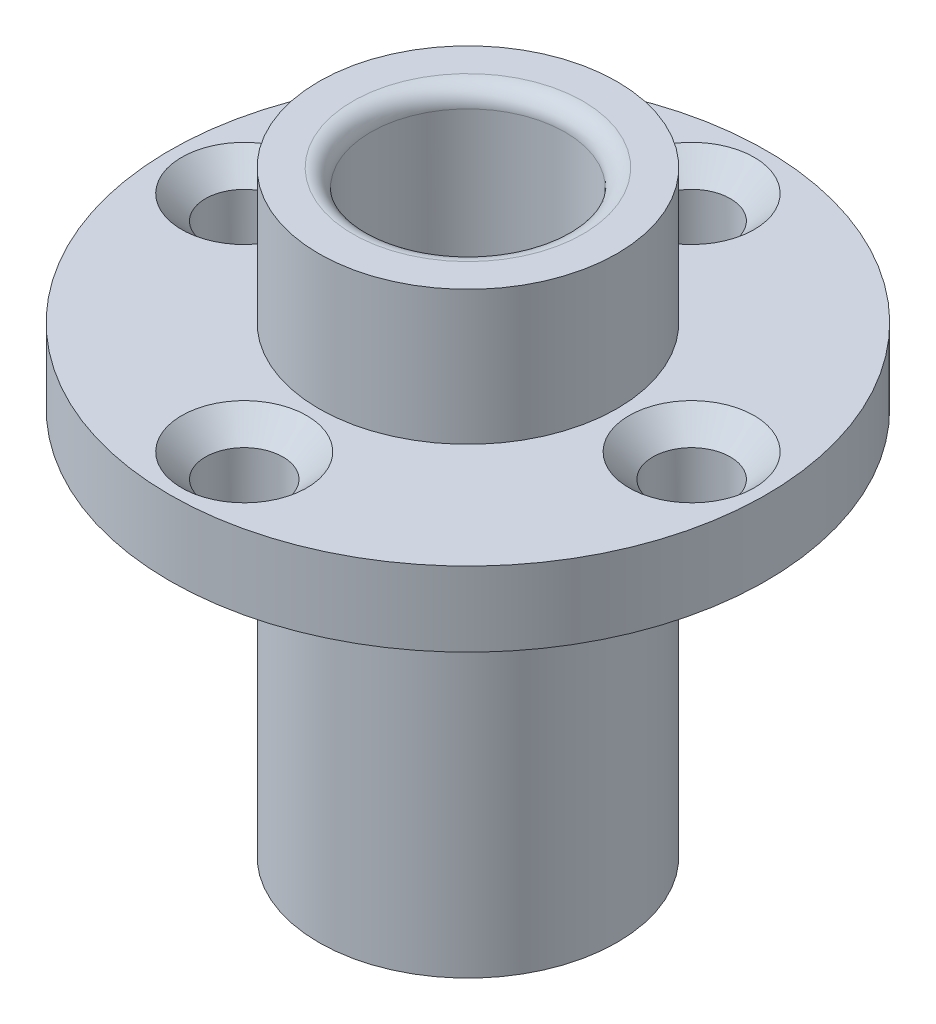
ISO-10303-21;
HEADER;
FILE_DESCRIPTION(('STEP AP214'),'2;1');
FILE_NAME('part.step','',(''),(''),'','','');
FILE_SCHEMA(('AUTOMOTIVE_DESIGN { 1 0 10303 214 1 1 1 1 }'));
ENDSEC;
DATA;
#1=APPLICATION_CONTEXT('core data for automotive mechanical design processes');
#2=APPLICATION_PROTOCOL_DEFINITION('international standard','automotive_design',2000,#1);
#3=PRODUCT_CONTEXT('',#1,'mechanical');
#4=PRODUCT('Part','Part','',(#3));
#5=PRODUCT_RELATED_PRODUCT_CATEGORY('part','',(#4));
#6=PRODUCT_DEFINITION_FORMATION('','',#4);
#7=PRODUCT_DEFINITION_CONTEXT('part definition',#1,'design');
#8=PRODUCT_DEFINITION('design','',#6,#7);
#9=PRODUCT_DEFINITION_SHAPE('','',#8);
#10=(LENGTH_UNIT() NAMED_UNIT(*) SI_UNIT(.MILLI.,.METRE.));
#11=(NAMED_UNIT(*) PLANE_ANGLE_UNIT() SI_UNIT($,.RADIAN.));
#12=(NAMED_UNIT(*) SI_UNIT($,.STERADIAN.) SOLID_ANGLE_UNIT());
#13=UNCERTAINTY_MEASURE_WITH_UNIT(LENGTH_MEASURE(1.E-05),#10,'distance_accuracy_value','');
#14=(GEOMETRIC_REPRESENTATION_CONTEXT(3) GLOBAL_UNCERTAINTY_ASSIGNED_CONTEXT((#13)) GLOBAL_UNIT_ASSIGNED_CONTEXT((#10,
#11,#12)) REPRESENTATION_CONTEXT('',''));
#15=CARTESIAN_POINT('',(0.,0.,0.));
#16=DIRECTION('',(0.,0.,1.));
#17=DIRECTION('',(1.,0.,0.));
#18=AXIS2_PLACEMENT_3D('',#15,#16,#17);
#19=CARTESIAN_POINT('',(6.35,12.7,0.));
#20=DIRECTION('',(0.,-1.,0.));
#21=DIRECTION('',(0.,0.,-1.));
#22=AXIS2_PLACEMENT_3D('',#19,#20,#21);
#23=PLANE('',#22);
#24=CARTESIAN_POINT('',(0.,12.7,0.));
#25=DIRECTION('',(0.,-1.,0.));
#26=DIRECTION('',(0.,0.,-1.));
#27=AXIS2_PLACEMENT_3D('',#24,#25,#26);
#28=CIRCLE('',#27,4.9022);
#29=CARTESIAN_POINT('',(0.,12.7,-4.9022));
#30=VERTEX_POINT('',#29);
#31=EDGE_CURVE('E10',#30,#30,#28,.T.);
#32=ORIENTED_EDGE('',*,*,#31,.T.);
#33=EDGE_LOOP('',(#32));
#34=FACE_BOUND('',#33,.T.);
#35=CARTESIAN_POINT('',(0.,12.7,0.));
#36=DIRECTION('',(0.,1.,0.));
#37=DIRECTION('',(0.,0.,1.));
#38=AXIS2_PLACEMENT_3D('',#35,#36,#37);
#39=CIRCLE('',#38,6.35);
#40=CARTESIAN_POINT('',(0.,12.7,6.35));
#41=VERTEX_POINT('',#40);
#42=EDGE_CURVE('E121',#41,#41,#39,.T.);
#43=ORIENTED_EDGE('',*,*,#42,.T.);
#44=EDGE_LOOP('',(#43));
#45=FACE_BOUND('',#44,.T.);
#46=ADVANCED_FACE('F45',(#34,#45),#23,.F.);
#47=CARTESIAN_POINT('',(0.,0.,0.));
#48=DIRECTION('',(0.,1.,0.));
#49=DIRECTION('',(0.,0.,1.));
#50=AXIS2_PLACEMENT_3D('',#47,#48,#49);
#51=CYLINDRICAL_SURFACE('',#50,4.1402);
#52=CARTESIAN_POINT('',(0.,-11.938,0.));
#53=DIRECTION('',(0.,1.,0.));
#54=DIRECTION('',(0.,0.,1.));
#55=AXIS2_PLACEMENT_3D('',#52,#53,#54);
#56=CIRCLE('',#55,4.1402);
#57=CARTESIAN_POINT('',(0.,-11.938,4.1402));
#58=VERTEX_POINT('',#57);
#59=EDGE_CURVE('E53',#58,#58,#56,.F.);
#60=ORIENTED_EDGE('',*,*,#59,.T.);
#61=EDGE_LOOP('',(#60));
#62=FACE_BOUND('',#61,.T.);
#63=CARTESIAN_POINT('',(0.,11.938,0.));
#64=DIRECTION('',(0.,-1.,0.));
#65=DIRECTION('',(0.,0.,-1.));
#66=AXIS2_PLACEMENT_3D('',#63,#64,#65);
#67=CIRCLE('',#66,4.1402);
#68=CARTESIAN_POINT('',(0.,11.938,-4.1402));
#69=VERTEX_POINT('',#68);
#70=EDGE_CURVE('E58',#69,#69,#67,.F.);
#71=ORIENTED_EDGE('',*,*,#70,.T.);
#72=EDGE_LOOP('',(#71));
#73=FACE_BOUND('',#72,.T.);
#74=ADVANCED_FACE('F164',(#62,#73),#51,.F.);
#75=CARTESIAN_POINT('',(4.1402,-12.7,0.));
#76=DIRECTION('',(0.,1.,0.));
#77=DIRECTION('',(0.,0.,1.));
#78=AXIS2_PLACEMENT_3D('',#75,#76,#77);
#79=PLANE('',#78);
#80=CARTESIAN_POINT('',(0.,-12.7,0.));
#81=DIRECTION('',(0.,1.,0.));
#82=DIRECTION('',(0.,0.,1.));
#83=AXIS2_PLACEMENT_3D('',#80,#81,#82);
#84=CIRCLE('',#83,4.9022);
#85=CARTESIAN_POINT('',(0.,-12.7,4.9022));
#86=VERTEX_POINT('',#85);
#87=EDGE_CURVE('E63',#86,#86,#84,.T.);
#88=ORIENTED_EDGE('',*,*,#87,.T.);
#89=EDGE_LOOP('',(#88));
#90=FACE_BOUND('',#89,.T.);
#91=CARTESIAN_POINT('',(0.,-12.7,0.));
#92=DIRECTION('',(0.,1.,0.));
#93=DIRECTION('',(0.,0.,1.));
#94=AXIS2_PLACEMENT_3D('',#91,#92,#93);
#95=CIRCLE('',#94,6.35);
#96=CARTESIAN_POINT('',(0.,-12.7,6.35));
#97=VERTEX_POINT('',#96);
#98=EDGE_CURVE('E101',#97,#97,#95,.T.);
#99=ORIENTED_EDGE('',*,*,#98,.F.);
#100=EDGE_LOOP('',(#99));
#101=FACE_BOUND('',#100,.T.);
#102=ADVANCED_FACE('F170',(#90,#101),#79,.F.);
#103=CARTESIAN_POINT('',(0.,0.,0.));
#104=DIRECTION('',(0.,1.,0.));
#105=DIRECTION('',(0.,0.,1.));
#106=AXIS2_PLACEMENT_3D('',#103,#104,#105);
#107=CYLINDRICAL_SURFACE('',#106,6.35);
#108=CARTESIAN_POINT('',(0.,3.81,0.));
#109=DIRECTION('',(0.,1.,0.));
#110=DIRECTION('',(0.,0.,1.));
#111=AXIS2_PLACEMENT_3D('',#108,#109,#110);
#112=CIRCLE('',#111,6.35);
#113=CARTESIAN_POINT('',(0.,3.81,6.35));
#114=VERTEX_POINT('',#113);
#115=EDGE_CURVE('E105',#114,#114,#112,.T.);
#116=ORIENTED_EDGE('',*,*,#115,.F.);
#117=EDGE_LOOP('',(#116));
#118=FACE_BOUND('',#117,.T.);
#119=ORIENTED_EDGE('',*,*,#98,.T.);
#120=EDGE_LOOP('',(#119));
#121=FACE_BOUND('',#120,.T.);
#122=ADVANCED_FACE('F209',(#118,#121),#107,.T.);
#123=CARTESIAN_POINT('',(6.35,3.81,0.));
#124=DIRECTION('',(0.,1.,0.));
#125=DIRECTION('',(0.,0.,1.));
#126=AXIS2_PLACEMENT_3D('',#123,#124,#125);
#127=PLANE('',#126);
#128=CARTESIAN_POINT('',(9.525,3.81,0.));
#129=DIRECTION('',(0.,1.,0.));
#130=DIRECTION('',(0.,0.,1.));
#131=AXIS2_PLACEMENT_3D('',#128,#129,#130);
#132=CIRCLE('',#131,1.65);
#133=CARTESIAN_POINT('',(9.525,3.81,1.65000000000003));
#134=VERTEX_POINT('',#133);
#135=EDGE_CURVE('E129',#134,#134,#132,.T.);
#136=ORIENTED_EDGE('',*,*,#135,.T.);
#137=EDGE_LOOP('',(#136));
#138=FACE_BOUND('',#137,.T.);
#139=CARTESIAN_POINT('',(0.,3.81,9.525));
#140=DIRECTION('',(0.,1.,0.));
#141=DIRECTION('',(0.,0.,1.));
#142=AXIS2_PLACEMENT_3D('',#139,#140,#141);
#143=CIRCLE('',#142,1.65);
#144=CARTESIAN_POINT('',(0.,3.81,11.175));
#145=VERTEX_POINT('',#144);
#146=EDGE_CURVE('E133',#145,#145,#143,.T.);
#147=ORIENTED_EDGE('',*,*,#146,.T.);
#148=EDGE_LOOP('',(#147));
#149=FACE_BOUND('',#148,.T.);
#150=CARTESIAN_POINT('',(-9.525,3.81,0.));
#151=DIRECTION('',(0.,1.,0.));
#152=DIRECTION('',(0.,0.,1.));
#153=AXIS2_PLACEMENT_3D('',#150,#151,#152);
#154=CIRCLE('',#153,1.65);
#155=CARTESIAN_POINT('',(-9.525,3.81,1.6499999999999));
#156=VERTEX_POINT('',#155);
#157=EDGE_CURVE('E137',#156,#156,#154,.T.);
#158=ORIENTED_EDGE('',*,*,#157,.T.);
#159=EDGE_LOOP('',(#158));
#160=FACE_BOUND('',#159,.T.);
#161=CARTESIAN_POINT('',(0.,3.81,-9.525));
#162=DIRECTION('',(0.,1.,0.));
#163=DIRECTION('',(0.,0.,1.));
#164=AXIS2_PLACEMENT_3D('',#161,#162,#163);
#165=CIRCLE('',#164,1.65);
#166=CARTESIAN_POINT('',(0.,3.81,-7.875));
#167=VERTEX_POINT('',#166);
#168=EDGE_CURVE('E125',#167,#167,#165,.T.);
#169=ORIENTED_EDGE('',*,*,#168,.T.);
#170=EDGE_LOOP('',(#169));
#171=FACE_BOUND('',#170,.T.);
#172=CARTESIAN_POINT('',(0.,3.81,0.));
#173=DIRECTION('',(0.,1.,0.));
#174=DIRECTION('',(0.,0.,1.));
#175=AXIS2_PLACEMENT_3D('',#172,#173,#174);
#176=CIRCLE('',#175,12.7);
#177=CARTESIAN_POINT('',(0.,3.81,12.7));
#178=VERTEX_POINT('',#177);
#179=EDGE_CURVE('E109',#178,#178,#176,.T.);
#180=ORIENTED_EDGE('',*,*,#179,.F.);
#181=EDGE_LOOP('',(#180));
#182=FACE_BOUND('',#181,.T.);
#183=ORIENTED_EDGE('',*,*,#115,.T.);
#184=EDGE_LOOP('',(#183));
#185=FACE_BOUND('',#184,.T.);
#186=ADVANCED_FACE('F142',(#138,#149,#160,#171,#182,#185),#127,.F.);
#187=CARTESIAN_POINT('',(0.,0.,0.));
#188=DIRECTION('',(0.,1.,0.));
#189=DIRECTION('',(0.,0.,1.));
#190=AXIS2_PLACEMENT_3D('',#187,#188,#189);
#191=CYLINDRICAL_SURFACE('',#190,12.7);
#192=CARTESIAN_POINT('',(0.,6.985,0.));
#193=DIRECTION('',(0.,1.,0.));
#194=DIRECTION('',(0.,0.,1.));
#195=AXIS2_PLACEMENT_3D('',#192,#193,#194);
#196=CIRCLE('',#195,12.7);
#197=CARTESIAN_POINT('',(0.,6.985,12.7));
#198=VERTEX_POINT('',#197);
#199=EDGE_CURVE('E113',#198,#198,#196,.T.);
#200=ORIENTED_EDGE('',*,*,#199,.F.);
#201=EDGE_LOOP('',(#200));
#202=FACE_BOUND('',#201,.T.);
#203=ORIENTED_EDGE('',*,*,#179,.T.);
#204=EDGE_LOOP('',(#203));
#205=FACE_BOUND('',#204,.T.);
#206=ADVANCED_FACE('F219',(#202,#205),#191,.T.);
#207=CARTESIAN_POINT('',(12.7,6.985,0.));
#208=DIRECTION('',(0.,-1.,0.));
#209=DIRECTION('',(0.,0.,-1.));
#210=AXIS2_PLACEMENT_3D('',#207,#208,#209);
#211=PLANE('',#210);
#212=CARTESIAN_POINT('',(-9.525,6.985,0.));
#213=DIRECTION('',(0.,-1.,0.));
#214=DIRECTION('',(0.,0.,-1.));
#215=AXIS2_PLACEMENT_3D('',#212,#213,#214);
#216=CIRCLE('',#215,2.666);
#217=CARTESIAN_POINT('',(-9.525,6.985,-2.6660000000001));
#218=VERTEX_POINT('',#217);
#219=EDGE_CURVE('E69',#218,#218,#216,.T.);
#220=ORIENTED_EDGE('',*,*,#219,.T.);
#221=EDGE_LOOP('',(#220));
#222=FACE_BOUND('',#221,.T.);
#223=CARTESIAN_POINT('',(0.,6.985,9.525));
#224=DIRECTION('',(0.,-1.,0.));
#225=DIRECTION('',(0.,0.,-1.));
#226=AXIS2_PLACEMENT_3D('',#223,#224,#225);
#227=CIRCLE('',#226,2.666);
#228=CARTESIAN_POINT('',(0.,6.985,6.859));
#229=VERTEX_POINT('',#228);
#230=EDGE_CURVE('E77',#229,#229,#227,.T.);
#231=ORIENTED_EDGE('',*,*,#230,.T.);
#232=EDGE_LOOP('',(#231));
#233=FACE_BOUND('',#232,.T.);
#234=CARTESIAN_POINT('',(9.525,6.985,0.));
#235=DIRECTION('',(0.,-1.,0.));
#236=DIRECTION('',(0.,0.,-1.));
#237=AXIS2_PLACEMENT_3D('',#234,#235,#236);
#238=CIRCLE('',#237,2.666);
#239=CARTESIAN_POINT('',(9.525,6.985,-2.66599999999996));
#240=VERTEX_POINT('',#239);
#241=EDGE_CURVE('E85',#240,#240,#238,.T.);
#242=ORIENTED_EDGE('',*,*,#241,.T.);
#243=EDGE_LOOP('',(#242));
#244=FACE_BOUND('',#243,.T.);
#245=CARTESIAN_POINT('',(0.,6.985,-9.525));
#246=DIRECTION('',(0.,-1.,0.));
#247=DIRECTION('',(0.,0.,-1.));
#248=AXIS2_PLACEMENT_3D('',#245,#246,#247);
#249=CIRCLE('',#248,2.666);
#250=CARTESIAN_POINT('',(0.,6.985,-12.191));
#251=VERTEX_POINT('',#250);
#252=EDGE_CURVE('E93',#251,#251,#249,.T.);
#253=ORIENTED_EDGE('',*,*,#252,.T.);
#254=EDGE_LOOP('',(#253));
#255=FACE_BOUND('',#254,.T.);
#256=CARTESIAN_POINT('',(0.,6.985,0.));
#257=DIRECTION('',(0.,1.,0.));
#258=DIRECTION('',(0.,0.,1.));
#259=AXIS2_PLACEMENT_3D('',#256,#257,#258);
#260=CIRCLE('',#259,6.35);
#261=CARTESIAN_POINT('',(0.,6.985,6.35));
#262=VERTEX_POINT('',#261);
#263=EDGE_CURVE('E117',#262,#262,#260,.T.);
#264=ORIENTED_EDGE('',*,*,#263,.F.);
#265=EDGE_LOOP('',(#264));
#266=FACE_BOUND('',#265,.T.);
#267=ORIENTED_EDGE('',*,*,#199,.T.);
#268=EDGE_LOOP('',(#267));
#269=FACE_BOUND('',#268,.T.);
#270=ADVANCED_FACE('F225',(#222,#233,#244,#255,#266,#269),#211,.F.);
#271=CARTESIAN_POINT('',(0.,0.,0.));
#272=DIRECTION('',(0.,1.,0.));
#273=DIRECTION('',(0.,0.,1.));
#274=AXIS2_PLACEMENT_3D('',#271,#272,#273);
#275=CYLINDRICAL_SURFACE('',#274,6.35);
#276=ORIENTED_EDGE('',*,*,#42,.F.);
#277=EDGE_LOOP('',(#276));
#278=FACE_BOUND('',#277,.T.);
#279=ORIENTED_EDGE('',*,*,#263,.T.);
#280=EDGE_LOOP('',(#279));
#281=FACE_BOUND('',#280,.T.);
#282=ADVANCED_FACE('F228',(#278,#281),#275,.T.);
#283=CARTESIAN_POINT('',(0.,-12.7,-9.525));
#284=DIRECTION('',(0.,1.,0.));
#285=DIRECTION('',(0.,0.,1.));
#286=AXIS2_PLACEMENT_3D('',#283,#284,#285);
#287=CYLINDRICAL_SURFACE('',#286,1.65);
#288=CARTESIAN_POINT('',(0.,5.96900000000001,-9.525));
#289=DIRECTION('',(0.,-1.,0.));
#290=DIRECTION('',(0.,0.,-1.));
#291=AXIS2_PLACEMENT_3D('',#288,#289,#290);
#292=CIRCLE('',#291,1.65);
#293=CARTESIAN_POINT('',(0.,5.96900000000001,-11.175));
#294=VERTEX_POINT('',#293);
#295=EDGE_CURVE('E97',#294,#294,#292,.F.);
#296=ORIENTED_EDGE('',*,*,#295,.T.);
#297=EDGE_LOOP('',(#296));
#298=FACE_BOUND('',#297,.T.);
#299=ORIENTED_EDGE('',*,*,#168,.F.);
#300=EDGE_LOOP('',(#299));
#301=FACE_BOUND('',#300,.T.);
#302=ADVANCED_FACE('F159',(#298,#301),#287,.F.);
#303=CARTESIAN_POINT('',(0.,5.96900000000001,-9.525));
#304=DIRECTION('',(0.,1.,0.));
#305=DIRECTION('',(0.,0.,1.));
#306=AXIS2_PLACEMENT_3D('',#303,#304,#305);
#307=CONICAL_SURFACE('',#306,1.65,0.785398163397451);
#308=ORIENTED_EDGE('',*,*,#252,.F.);
#309=EDGE_LOOP('',(#308));
#310=FACE_BOUND('',#309,.T.);
#311=ORIENTED_EDGE('',*,*,#295,.F.);
#312=EDGE_LOOP('',(#311));
#313=FACE_BOUND('',#312,.T.);
#314=ADVANCED_FACE('F148',(#310,#313),#307,.F.);
#315=CARTESIAN_POINT('',(-9.525,-12.7,0.));
#316=DIRECTION('',(0.,1.,0.));
#317=DIRECTION('',(0.,0.,1.));
#318=AXIS2_PLACEMENT_3D('',#315,#316,#317);
#319=CYLINDRICAL_SURFACE('',#318,1.65);
#320=CARTESIAN_POINT('',(-9.525,5.96900000000001,0.));
#321=DIRECTION('',(0.,-1.,0.));
#322=DIRECTION('',(0.,0.,-1.));
#323=AXIS2_PLACEMENT_3D('',#320,#321,#322);
#324=CIRCLE('',#323,1.65);
#325=CARTESIAN_POINT('',(-9.525,5.96900000000001,-1.6500000000001));
#326=VERTEX_POINT('',#325);
#327=EDGE_CURVE('E73',#326,#326,#324,.F.);
#328=ORIENTED_EDGE('',*,*,#327,.T.);
#329=EDGE_LOOP('',(#328));
#330=FACE_BOUND('',#329,.T.);
#331=ORIENTED_EDGE('',*,*,#157,.F.);
#332=EDGE_LOOP('',(#331));
#333=FACE_BOUND('',#332,.T.);
#334=ADVANCED_FACE('F145',(#330,#333),#319,.F.);
#335=CARTESIAN_POINT('',(0.,-12.7,9.525));
#336=DIRECTION('',(0.,1.,0.));
#337=DIRECTION('',(0.,0.,1.));
#338=AXIS2_PLACEMENT_3D('',#335,#336,#337);
#339=CYLINDRICAL_SURFACE('',#338,1.65);
#340=CARTESIAN_POINT('',(0.,5.96900000000001,9.525));
#341=DIRECTION('',(0.,-1.,0.));
#342=DIRECTION('',(0.,0.,-1.));
#343=AXIS2_PLACEMENT_3D('',#340,#341,#342);
#344=CIRCLE('',#343,1.65);
#345=CARTESIAN_POINT('',(0.,5.96900000000001,7.875));
#346=VERTEX_POINT('',#345);
#347=EDGE_CURVE('E81',#346,#346,#344,.F.);
#348=ORIENTED_EDGE('',*,*,#347,.T.);
#349=EDGE_LOOP('',(#348));
#350=FACE_BOUND('',#349,.T.);
#351=ORIENTED_EDGE('',*,*,#146,.F.);
#352=EDGE_LOOP('',(#351));
#353=FACE_BOUND('',#352,.T.);
#354=ADVANCED_FACE('F147',(#350,#353),#339,.F.);
#355=CARTESIAN_POINT('',(9.525,-12.7,0.));
#356=DIRECTION('',(0.,1.,0.));
#357=DIRECTION('',(0.,0.,1.));
#358=AXIS2_PLACEMENT_3D('',#355,#356,#357);
#359=CYLINDRICAL_SURFACE('',#358,1.65);
#360=CARTESIAN_POINT('',(9.525,5.96900000000001,0.));
#361=DIRECTION('',(0.,-1.,0.));
#362=DIRECTION('',(0.,0.,-1.));
#363=AXIS2_PLACEMENT_3D('',#360,#361,#362);
#364=CIRCLE('',#363,1.65);
#365=CARTESIAN_POINT('',(9.525,5.96900000000001,-1.64999999999997));
#366=VERTEX_POINT('',#365);
#367=EDGE_CURVE('E89',#366,#366,#364,.F.);
#368=ORIENTED_EDGE('',*,*,#367,.T.);
#369=EDGE_LOOP('',(#368));
#370=FACE_BOUND('',#369,.T.);
#371=ORIENTED_EDGE('',*,*,#135,.F.);
#372=EDGE_LOOP('',(#371));
#373=FACE_BOUND('',#372,.T.);
#374=ADVANCED_FACE('F155',(#370,#373),#359,.F.);
#375=CARTESIAN_POINT('',(9.525,5.96900000000001,0.));
#376=DIRECTION('',(0.,1.,0.));
#377=DIRECTION('',(0.,0.,1.));
#378=AXIS2_PLACEMENT_3D('',#375,#376,#377);
#379=CONICAL_SURFACE('',#378,1.65,0.785398163397451);
#380=ORIENTED_EDGE('',*,*,#241,.F.);
#381=EDGE_LOOP('',(#380));
#382=FACE_BOUND('',#381,.T.);
#383=ORIENTED_EDGE('',*,*,#367,.F.);
#384=EDGE_LOOP('',(#383));
#385=FACE_BOUND('',#384,.T.);
#386=ADVANCED_FACE('F179',(#382,#385),#379,.F.);
#387=CARTESIAN_POINT('',(0.,5.96900000000001,9.525));
#388=DIRECTION('',(0.,1.,0.));
#389=DIRECTION('',(0.,0.,1.));
#390=AXIS2_PLACEMENT_3D('',#387,#388,#389);
#391=CONICAL_SURFACE('',#390,1.65,0.785398163397451);
#392=ORIENTED_EDGE('',*,*,#230,.F.);
#393=EDGE_LOOP('',(#392));
#394=FACE_BOUND('',#393,.T.);
#395=ORIENTED_EDGE('',*,*,#347,.F.);
#396=EDGE_LOOP('',(#395));
#397=FACE_BOUND('',#396,.T.);
#398=ADVANCED_FACE('F185',(#394,#397),#391,.F.);
#399=CARTESIAN_POINT('',(-9.525,5.96900000000001,0.));
#400=DIRECTION('',(0.,1.,0.));
#401=DIRECTION('',(0.,0.,1.));
#402=AXIS2_PLACEMENT_3D('',#399,#400,#401);
#403=CONICAL_SURFACE('',#402,1.65,0.785398163397451);
#404=ORIENTED_EDGE('',*,*,#219,.F.);
#405=EDGE_LOOP('',(#404));
#406=FACE_BOUND('',#405,.T.);
#407=ORIENTED_EDGE('',*,*,#327,.F.);
#408=EDGE_LOOP('',(#407));
#409=FACE_BOUND('',#408,.T.);
#410=ADVANCED_FACE('F192',(#406,#409),#403,.F.);
#411=CARTESIAN_POINT('',(0.,-11.938,0.));
#412=DIRECTION('',(0.,1.,0.));
#413=DIRECTION('',(0.,0.,1.));
#414=AXIS2_PLACEMENT_3D('',#411,#412,#413);
#415=TOROIDAL_SURFACE('',#414,4.9022,0.762);
#416=ORIENTED_EDGE('',*,*,#59,.F.);
#417=EDGE_LOOP('',(#416));
#418=FACE_BOUND('',#417,.T.);
#419=ORIENTED_EDGE('',*,*,#87,.F.);
#420=EDGE_LOOP('',(#419));
#421=FACE_BOUND('',#420,.T.);
#422=ADVANCED_FACE('F196',(#418,#421),#415,.T.);
#423=CARTESIAN_POINT('',(0.,11.938,0.));
#424=DIRECTION('',(0.,-1.,0.));
#425=DIRECTION('',(0.,0.,-1.));
#426=AXIS2_PLACEMENT_3D('',#423,#424,#425);
#427=TOROIDAL_SURFACE('',#426,4.9022,0.762);
#428=ORIENTED_EDGE('',*,*,#31,.F.);
#429=EDGE_LOOP('',(#428));
#430=FACE_BOUND('',#429,.T.);
#431=ORIENTED_EDGE('',*,*,#70,.F.);
#432=EDGE_LOOP('',(#431));
#433=FACE_BOUND('',#432,.T.);
#434=ADVANCED_FACE('F47',(#430,#433),#427,.T.);
#435=CLOSED_SHELL('',(#46,#74,#102,#122,#186,#206,#270,#282,#302,#314,#334,#354,#374,#386,#398,
#410,#422,#434));
#436=MANIFOLD_SOLID_BREP('B2',#435);
#437=ADVANCED_BREP_SHAPE_REPRESENTATION('',(#18,#436),#14);
#438=SHAPE_DEFINITION_REPRESENTATION(#9,#437);
ENDSEC;
END-ISO-10303-21;
